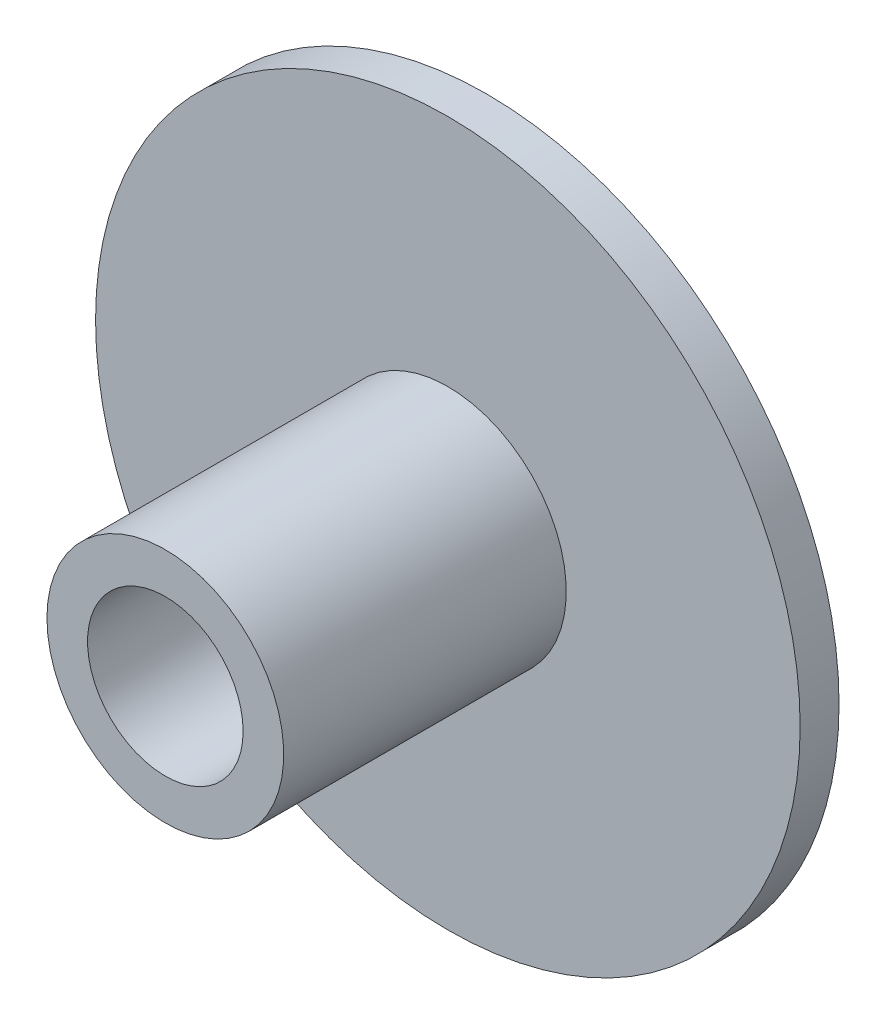
ISO-10303-21;
HEADER;
FILE_DESCRIPTION(('STEP AP214'),'2;1');
FILE_NAME('part.step','',(''),(''),'','','');
FILE_SCHEMA(('AUTOMOTIVE_DESIGN { 1 0 10303 214 1 1 1 1 }'));
ENDSEC;
DATA;
#1=APPLICATION_CONTEXT('core data for automotive mechanical design processes');
#2=APPLICATION_PROTOCOL_DEFINITION('international standard','automotive_design',2000,#1);
#3=PRODUCT_CONTEXT('',#1,'mechanical');
#4=PRODUCT('Part','Part','',(#3));
#5=PRODUCT_RELATED_PRODUCT_CATEGORY('part','',(#4));
#6=PRODUCT_DEFINITION_FORMATION('','',#4);
#7=PRODUCT_DEFINITION_CONTEXT('part definition',#1,'design');
#8=PRODUCT_DEFINITION('design','',#6,#7);
#9=PRODUCT_DEFINITION_SHAPE('','',#8);
#10=(LENGTH_UNIT() NAMED_UNIT(*) SI_UNIT(.MILLI.,.METRE.));
#11=(NAMED_UNIT(*) PLANE_ANGLE_UNIT() SI_UNIT($,.RADIAN.));
#12=(NAMED_UNIT(*) SI_UNIT($,.STERADIAN.) SOLID_ANGLE_UNIT());
#13=UNCERTAINTY_MEASURE_WITH_UNIT(LENGTH_MEASURE(1.E-05),#10,'distance_accuracy_value','');
#14=(GEOMETRIC_REPRESENTATION_CONTEXT(3) GLOBAL_UNCERTAINTY_ASSIGNED_CONTEXT((#13)) GLOBAL_UNIT_ASSIGNED_CONTEXT((#10,
#11,#12)) REPRESENTATION_CONTEXT('',''));
#15=CARTESIAN_POINT('',(0.,0.,0.));
#16=DIRECTION('',(0.,0.,1.));
#17=DIRECTION('',(1.,0.,0.));
#18=AXIS2_PLACEMENT_3D('',#15,#16,#17);
#19=CARTESIAN_POINT('',(0.,0.,0.8636));
#20=DIRECTION('',(0.,0.,1.));
#21=DIRECTION('',(1.,0.,0.));
#22=AXIS2_PLACEMENT_3D('',#19,#20,#21);
#23=PLANE('',#22);
#24=CARTESIAN_POINT('',(0.,0.,0.8636));
#25=DIRECTION('',(0.,0.,1.));
#26=DIRECTION('',(1.,0.,0.));
#27=AXIS2_PLACEMENT_3D('',#24,#25,#26);
#28=CIRCLE('',#27,7.8232);
#29=CARTESIAN_POINT('',(7.8232,0.,0.8636));
#30=VERTEX_POINT('',#29);
#31=EDGE_CURVE('E10',#30,#30,#28,.T.);
#32=ORIENTED_EDGE('',*,*,#31,.T.);
#33=EDGE_LOOP('',(#32));
#34=FACE_BOUND('',#33,.T.);
#35=CARTESIAN_POINT('',(0.,0.,0.8636));
#36=DIRECTION('',(0.,0.,1.));
#37=DIRECTION('',(1.,0.,0.));
#38=AXIS2_PLACEMENT_3D('',#35,#36,#37);
#39=CIRCLE('',#38,2.6289);
#40=CARTESIAN_POINT('',(-2.6289,0.,0.863600000000001));
#41=VERTEX_POINT('',#40);
#42=EDGE_CURVE('E54',#41,#41,#39,.T.);
#43=ORIENTED_EDGE('',*,*,#42,.F.);
#44=EDGE_LOOP('',(#43));
#45=FACE_BOUND('',#44,.T.);
#46=ADVANCED_FACE('F38',(#34,#45),#23,.T.);
#47=CARTESIAN_POINT('',(0.,0.,0.8636));
#48=DIRECTION('',(0.,0.,-1.));
#49=DIRECTION('',(-1.,0.,0.));
#50=AXIS2_PLACEMENT_3D('',#47,#48,#49);
#51=CYLINDRICAL_SURFACE('',#50,7.8232);
#52=ORIENTED_EDGE('',*,*,#31,.F.);
#53=EDGE_LOOP('',(#52));
#54=FACE_BOUND('',#53,.T.);
#55=CARTESIAN_POINT('',(0.,0.,0.));
#56=DIRECTION('',(0.,0.,1.));
#57=DIRECTION('',(1.,0.,0.));
#58=AXIS2_PLACEMENT_3D('',#55,#56,#57);
#59=CIRCLE('',#58,7.8232);
#60=CARTESIAN_POINT('',(7.8232,0.,0.));
#61=VERTEX_POINT('',#60);
#62=EDGE_CURVE('E42',#61,#61,#59,.T.);
#63=ORIENTED_EDGE('',*,*,#62,.T.);
#64=EDGE_LOOP('',(#63));
#65=FACE_BOUND('',#64,.T.);
#66=ADVANCED_FACE('F40',(#54,#65),#51,.T.);
#67=CARTESIAN_POINT('',(0.,0.,0.));
#68=DIRECTION('',(0.,0.,1.));
#69=DIRECTION('',(1.,0.,0.));
#70=AXIS2_PLACEMENT_3D('',#67,#68,#69);
#71=PLANE('',#70);
#72=CARTESIAN_POINT('',(0.,0.,0.));
#73=DIRECTION('',(0.,0.,1.));
#74=DIRECTION('',(1.,0.,0.));
#75=AXIS2_PLACEMENT_3D('',#72,#73,#74);
#76=CIRCLE('',#75,1.7272);
#77=CARTESIAN_POINT('',(1.7272,0.,0.));
#78=VERTEX_POINT('',#77);
#79=EDGE_CURVE('E58',#78,#78,#76,.T.);
#80=ORIENTED_EDGE('',*,*,#79,.T.);
#81=EDGE_LOOP('',(#80));
#82=FACE_BOUND('',#81,.T.);
#83=ORIENTED_EDGE('',*,*,#62,.F.);
#84=EDGE_LOOP('',(#83));
#85=FACE_BOUND('',#84,.T.);
#86=ADVANCED_FACE('F80',(#82,#85),#71,.F.);
#87=CARTESIAN_POINT('',(0.,0.,7.1374));
#88=DIRECTION('',(0.,0.,-1.));
#89=DIRECTION('',(-1.,0.,0.));
#90=AXIS2_PLACEMENT_3D('',#87,#88,#89);
#91=CYLINDRICAL_SURFACE('',#90,2.6289);
#92=CARTESIAN_POINT('',(0.,0.,7.1374));
#93=DIRECTION('',(0.,0.,1.));
#94=DIRECTION('',(1.,0.,0.));
#95=AXIS2_PLACEMENT_3D('',#92,#93,#94);
#96=CIRCLE('',#95,2.6289);
#97=CARTESIAN_POINT('',(-2.6289,0.,7.1374));
#98=VERTEX_POINT('',#97);
#99=EDGE_CURVE('E52',#98,#98,#96,.T.);
#100=CARTESIAN_POINT('',(-2.6289,0.,7.1374));
#101=CARTESIAN_POINT('',(-2.6289,0.,7.07204791666667));
#102=CARTESIAN_POINT('',(-2.6289,0.,7.00669583333333));
#103=CARTESIAN_POINT('',(-2.6289,0.,6.87599166666666));
#104=CARTESIAN_POINT('',(-2.6289,0.,6.81063958333333));
#105=CARTESIAN_POINT('',(-2.6289,0.,6.67993541666667));
#106=CARTESIAN_POINT('',(-2.6289,0.,6.61458333333333));
#107=CARTESIAN_POINT('',(-2.6289,0.,6.48387916666667));
#108=CARTESIAN_POINT('',(-2.6289,0.,6.41852708333333));
#109=CARTESIAN_POINT('',(-2.6289,0.,6.28782291666667));
#110=CARTESIAN_POINT('',(-2.6289,0.,6.22247083333333));
#111=CARTESIAN_POINT('',(-2.6289,0.,6.09176666666667));
#112=CARTESIAN_POINT('',(-2.6289,0.,6.02641458333333));
#113=CARTESIAN_POINT('',(-2.6289,0.,5.89571041666667));
#114=CARTESIAN_POINT('',(-2.6289,0.,5.83035833333333));
#115=CARTESIAN_POINT('',(-2.6289,0.,5.69965416666667));
#116=CARTESIAN_POINT('',(-2.6289,0.,5.63430208333333));
#117=CARTESIAN_POINT('',(-2.6289,0.,5.50359791666667));
#118=CARTESIAN_POINT('',(-2.6289,0.,5.43824583333333));
#119=CARTESIAN_POINT('',(-2.6289,0.,5.30754166666667));
#120=CARTESIAN_POINT('',(-2.6289,0.,5.24218958333333));
#121=CARTESIAN_POINT('',(-2.6289,0.,5.11148541666667));
#122=CARTESIAN_POINT('',(-2.6289,0.,5.04613333333333));
#123=CARTESIAN_POINT('',(-2.6289,0.,4.91542916666667));
#124=CARTESIAN_POINT('',(-2.6289,0.,4.85007708333333));
#125=CARTESIAN_POINT('',(-2.6289,0.,4.71937291666667));
#126=CARTESIAN_POINT('',(-2.6289,0.,4.65402083333333));
#127=CARTESIAN_POINT('',(-2.6289,0.,4.52331666666667));
#128=CARTESIAN_POINT('',(-2.6289,0.,4.45796458333333));
#129=CARTESIAN_POINT('',(-2.6289,0.,4.32726041666667));
#130=CARTESIAN_POINT('',(-2.6289,0.,4.26190833333333));
#131=CARTESIAN_POINT('',(-2.6289,0.,4.13120416666667));
#132=CARTESIAN_POINT('',(-2.6289,0.,4.06585208333333));
#133=CARTESIAN_POINT('',(-2.6289,0.,3.93514791666667));
#134=CARTESIAN_POINT('',(-2.6289,0.,3.86979583333333));
#135=CARTESIAN_POINT('',(-2.6289,0.,3.73909166666667));
#136=CARTESIAN_POINT('',(-2.6289,0.,3.67373958333333));
#137=CARTESIAN_POINT('',(-2.6289,0.,3.54303541666667));
#138=CARTESIAN_POINT('',(-2.6289,0.,3.47768333333333));
#139=CARTESIAN_POINT('',(-2.6289,0.,3.34697916666667));
#140=CARTESIAN_POINT('',(-2.6289,0.,3.28162708333333));
#141=CARTESIAN_POINT('',(-2.6289,0.,3.15092291666667));
#142=CARTESIAN_POINT('',(-2.6289,0.,3.08557083333333));
#143=CARTESIAN_POINT('',(-2.6289,0.,2.95486666666667));
#144=CARTESIAN_POINT('',(-2.6289,0.,2.88951458333333));
#145=CARTESIAN_POINT('',(-2.6289,0.,2.75881041666667));
#146=CARTESIAN_POINT('',(-2.6289,0.,2.69345833333333));
#147=CARTESIAN_POINT('',(-2.6289,0.,2.56275416666667));
#148=CARTESIAN_POINT('',(-2.6289,0.,2.49740208333333));
#149=CARTESIAN_POINT('',(-2.6289,0.,2.36669791666667));
#150=CARTESIAN_POINT('',(-2.6289,0.,2.30134583333333));
#151=CARTESIAN_POINT('',(-2.6289,0.,2.17064166666667));
#152=CARTESIAN_POINT('',(-2.6289,0.,2.10528958333333));
#153=CARTESIAN_POINT('',(-2.6289,0.,1.97458541666667));
#154=CARTESIAN_POINT('',(-2.6289,0.,1.90923333333333));
#155=CARTESIAN_POINT('',(-2.6289,0.,1.77852916666667));
#156=CARTESIAN_POINT('',(-2.6289,0.,1.71317708333333));
#157=CARTESIAN_POINT('',(-2.6289,0.,1.58247291666667));
#158=CARTESIAN_POINT('',(-2.6289,0.,1.51712083333333));
#159=CARTESIAN_POINT('',(-2.6289,0.,1.38641666666667));
#160=CARTESIAN_POINT('',(-2.6289,0.,1.32106458333333));
#161=CARTESIAN_POINT('',(-2.6289,0.,1.19036041666667));
#162=CARTESIAN_POINT('',(-2.6289,0.,1.12500833333333));
#163=CARTESIAN_POINT('',(-2.6289,0.,0.994304166666667));
#164=CARTESIAN_POINT('',(-2.6289,0.,0.928952083333334));
#165=CARTESIAN_POINT('',(-2.6289,0.,0.863600000000001));
#166=B_SPLINE_CURVE_WITH_KNOTS('',3,(#100,#101,#102,#103,#104,#105,#106,#107,#108,#109,#110,
#111,#112,#113,#114,#115,#116,#117,#118,#119,#120,#121,#122,#123,#124,#125,#126,#127,#128,#129,
#130,#131,#132,#133,#134,#135,#136,#137,#138,#139,#140,#141,#142,#143,#144,#145,#146,#147,#148,
#149,#150,#151,#152,#153,#154,#155,#156,#157,#158,#159,#160,#161,#162,#163,#164,#165),
.UNSPECIFIED.,.F.,.F.,(4,2,2,2,2,2,2,2,2,2,2,2,2,2,2,2,2,2,2,2,2,2,2,2,2,2,2,2,2,2,2,2,4),(0.,
0.196056250000001,0.392112500000001,0.58816875,0.784225,0.98028125,1.1763375,1.37239375,1.56845,
1.76450625,1.9605625,2.15661875,2.352675,2.54873125,2.7447875,2.94084375,3.1369,3.33295625,
3.5290125,3.72506875,3.921125,4.11718125,4.3132375,4.50929375,4.70535,4.90140625,5.0974625,
5.29351875,5.489575,5.68563125,5.8816875,6.07774375,6.2738),.UNSPECIFIED.);
#167=EDGE_CURVE('BSEAM74',#98,#41,#166,.T.);
#168=ORIENTED_EDGE('',*,*,#99,.F.);
#169=ORIENTED_EDGE('',*,*,#42,.T.);
#170=ORIENTED_EDGE('',*,*,#167,.T.);
#171=ORIENTED_EDGE('',*,*,#167,.F.);
#172=EDGE_LOOP('',(#168,#170,#169,#171));
#173=FACE_BOUND('',#172,.T.);
#174=ADVANCED_FACE('F74',(#173),#91,.T.);
#175=CARTESIAN_POINT('',(0.,0.,7.1374));
#176=DIRECTION('',(0.,0.,1.));
#177=DIRECTION('',(1.,0.,0.));
#178=AXIS2_PLACEMENT_3D('',#175,#176,#177);
#179=PLANE('',#178);
#180=CARTESIAN_POINT('',(0.,0.,7.1374));
#181=DIRECTION('',(0.,0.,1.));
#182=DIRECTION('',(1.,0.,0.));
#183=AXIS2_PLACEMENT_3D('',#180,#181,#182);
#184=CIRCLE('',#183,1.72719999999999);
#185=CARTESIAN_POINT('',(1.72719999999999,0.,7.1374));
#186=VERTEX_POINT('',#185);
#187=EDGE_CURVE('E64',#186,#186,#184,.T.);
#188=ORIENTED_EDGE('',*,*,#187,.F.);
#189=EDGE_LOOP('',(#188));
#190=FACE_BOUND('',#189,.T.);
#191=ORIENTED_EDGE('',*,*,#99,.T.);
#192=EDGE_LOOP('',(#191));
#193=FACE_BOUND('',#192,.T.);
#194=ADVANCED_FACE('F71',(#190,#193),#179,.T.);
#195=CARTESIAN_POINT('',(0.,0.,7.1374));
#196=DIRECTION('',(0.,0.,1.));
#197=DIRECTION('',(1.,0.,0.));
#198=AXIS2_PLACEMENT_3D('',#195,#196,#197);
#199=CYLINDRICAL_SURFACE('',#198,1.72719999999999);
#200=ORIENTED_EDGE('',*,*,#79,.F.);
#201=EDGE_LOOP('',(#200));
#202=FACE_BOUND('',#201,.T.);
#203=ORIENTED_EDGE('',*,*,#187,.T.);
#204=EDGE_LOOP('',(#203));
#205=FACE_BOUND('',#204,.T.);
#206=ADVANCED_FACE('F69',(#202,#205),#199,.F.);
#207=CLOSED_SHELL('',(#46,#66,#86,#174,#194,#206));
#208=MANIFOLD_SOLID_BREP('B2',#207);
#209=ADVANCED_BREP_SHAPE_REPRESENTATION('',(#18,#208),#14);
#210=SHAPE_DEFINITION_REPRESENTATION(#9,#209);
ENDSEC;
END-ISO-10303-21;
